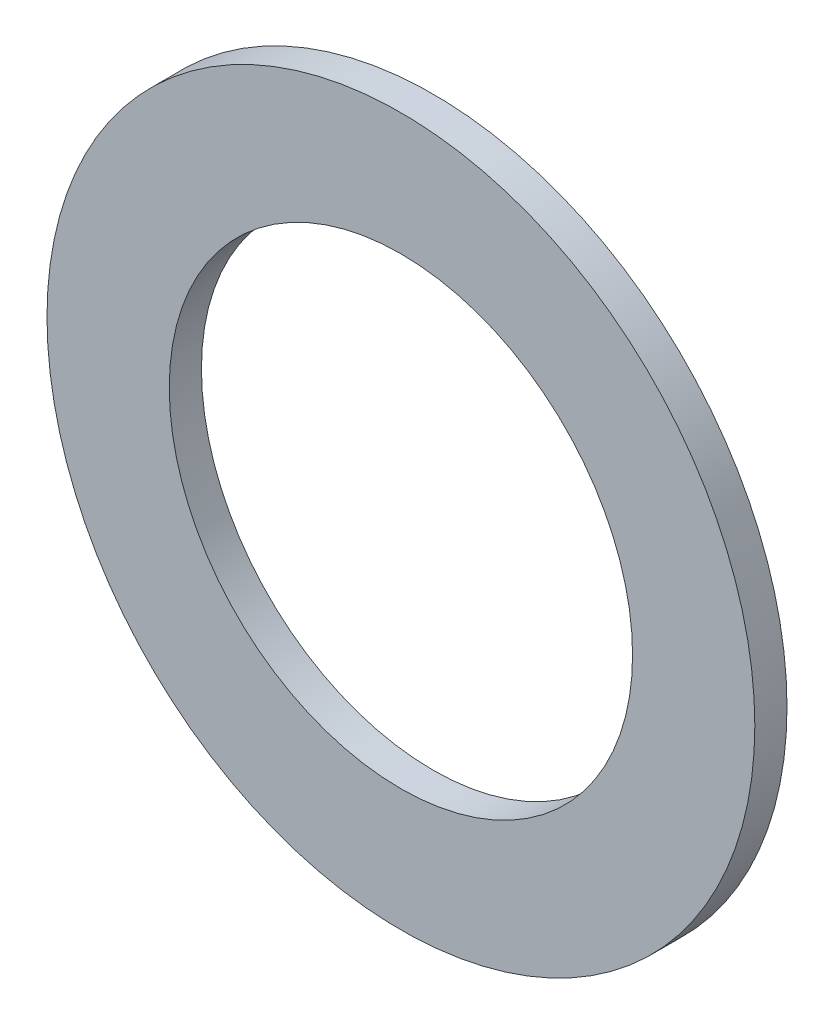
ISO-10303-21;
HEADER;
FILE_DESCRIPTION(('STEP AP214'),'2;1');
FILE_NAME('part.step','',(''),(''),'','','');
FILE_SCHEMA(('AUTOMOTIVE_DESIGN { 1 0 10303 214 1 1 1 1 }'));
ENDSEC;
DATA;
#1=APPLICATION_CONTEXT('core data for automotive mechanical design processes');
#2=APPLICATION_PROTOCOL_DEFINITION('international standard','automotive_design',2000,#1);
#3=PRODUCT_CONTEXT('',#1,'mechanical');
#4=PRODUCT('Part','Part','',(#3));
#5=PRODUCT_RELATED_PRODUCT_CATEGORY('part','',(#4));
#6=PRODUCT_DEFINITION_FORMATION('','',#4);
#7=PRODUCT_DEFINITION_CONTEXT('part definition',#1,'design');
#8=PRODUCT_DEFINITION('design','',#6,#7);
#9=PRODUCT_DEFINITION_SHAPE('','',#8);
#10=(LENGTH_UNIT() NAMED_UNIT(*) SI_UNIT(.MILLI.,.METRE.));
#11=(NAMED_UNIT(*) PLANE_ANGLE_UNIT() SI_UNIT($,.RADIAN.));
#12=(NAMED_UNIT(*) SI_UNIT($,.STERADIAN.) SOLID_ANGLE_UNIT());
#13=UNCERTAINTY_MEASURE_WITH_UNIT(LENGTH_MEASURE(1.E-05),#10,'distance_accuracy_value','');
#14=(GEOMETRIC_REPRESENTATION_CONTEXT(3) GLOBAL_UNCERTAINTY_ASSIGNED_CONTEXT((#13)) GLOBAL_UNIT_ASSIGNED_CONTEXT((#10,
#11,#12)) REPRESENTATION_CONTEXT('',''));
#15=CARTESIAN_POINT('',(0.,0.,0.));
#16=DIRECTION('',(0.,0.,1.));
#17=DIRECTION('',(1.,0.,0.));
#18=AXIS2_PLACEMENT_3D('',#15,#16,#17);
#19=CARTESIAN_POINT('',(0.,0.,-0.5));
#20=DIRECTION('',(0.,0.,-1.));
#21=DIRECTION('',(1.,0.,0.));
#22=AXIS2_PLACEMENT_3D('',#19,#20,#21);
#23=PLANE('',#22);
#24=CARTESIAN_POINT('',(0.,0.,-0.5));
#25=DIRECTION('',(0.,0.,1.));
#26=DIRECTION('',(1.,0.,0.));
#27=AXIS2_PLACEMENT_3D('',#24,#25,#26);
#28=CIRCLE('',#27,5.5);
#29=CARTESIAN_POINT('',(5.5,0.,-0.5));
#30=VERTEX_POINT('',#29);
#31=EDGE_CURVE('E10',#30,#30,#28,.T.);
#32=ORIENTED_EDGE('',*,*,#31,.F.);
#33=EDGE_LOOP('',(#32));
#34=FACE_BOUND('',#33,.T.);
#35=CARTESIAN_POINT('',(0.,0.,-0.5));
#36=DIRECTION('',(0.,0.,1.));
#37=DIRECTION('',(1.,0.,0.));
#38=AXIS2_PLACEMENT_3D('',#35,#36,#37);
#39=CIRCLE('',#38,3.6);
#40=CARTESIAN_POINT('',(3.6,0.,-0.5));
#41=VERTEX_POINT('',#40);
#42=EDGE_CURVE('E48',#41,#41,#39,.T.);
#43=ORIENTED_EDGE('',*,*,#42,.T.);
#44=EDGE_LOOP('',(#43));
#45=FACE_BOUND('',#44,.T.);
#46=ADVANCED_FACE('F37',(#34,#45),#23,.T.);
#47=CARTESIAN_POINT('',(0.,0.,0.));
#48=DIRECTION('',(0.,0.,-1.));
#49=DIRECTION('',(1.,0.,0.));
#50=AXIS2_PLACEMENT_3D('',#47,#48,#49);
#51=PLANE('',#50);
#52=CARTESIAN_POINT('',(0.,0.,0.));
#53=DIRECTION('',(0.,0.,1.));
#54=DIRECTION('',(1.,0.,0.));
#55=AXIS2_PLACEMENT_3D('',#52,#53,#54);
#56=CIRCLE('',#55,5.5);
#57=CARTESIAN_POINT('',(5.5,0.,0.));
#58=VERTEX_POINT('',#57);
#59=EDGE_CURVE('E41',#58,#58,#56,.T.);
#60=ORIENTED_EDGE('',*,*,#59,.T.);
#61=EDGE_LOOP('',(#60));
#62=FACE_BOUND('',#61,.T.);
#63=CARTESIAN_POINT('',(0.,0.,0.));
#64=DIRECTION('',(0.,0.,1.));
#65=DIRECTION('',(1.,0.,0.));
#66=AXIS2_PLACEMENT_3D('',#63,#64,#65);
#67=CIRCLE('',#66,3.6);
#68=CARTESIAN_POINT('',(3.6,0.,0.));
#69=VERTEX_POINT('',#68);
#70=EDGE_CURVE('E50',#69,#69,#67,.T.);
#71=ORIENTED_EDGE('',*,*,#70,.F.);
#72=EDGE_LOOP('',(#71));
#73=FACE_BOUND('',#72,.T.);
#74=ADVANCED_FACE('F63',(#62,#73),#51,.F.);
#75=CARTESIAN_POINT('',(0.,0.,-0.5));
#76=DIRECTION('',(0.,0.,1.));
#77=DIRECTION('',(-1.,0.,0.));
#78=AXIS2_PLACEMENT_3D('',#75,#76,#77);
#79=CYLINDRICAL_SURFACE('',#78,5.5);
#80=ORIENTED_EDGE('',*,*,#31,.T.);
#81=EDGE_LOOP('',(#80));
#82=FACE_BOUND('',#81,.T.);
#83=ORIENTED_EDGE('',*,*,#59,.F.);
#84=EDGE_LOOP('',(#83));
#85=FACE_BOUND('',#84,.T.);
#86=ADVANCED_FACE('F39',(#82,#85),#79,.T.);
#87=CARTESIAN_POINT('',(0.,0.,-0.5));
#88=DIRECTION('',(0.,0.,1.));
#89=DIRECTION('',(-1.,0.,0.));
#90=AXIS2_PLACEMENT_3D('',#87,#88,#89);
#91=CYLINDRICAL_SURFACE('',#90,3.6);
#92=ORIENTED_EDGE('',*,*,#42,.F.);
#93=EDGE_LOOP('',(#92));
#94=FACE_BOUND('',#93,.T.);
#95=ORIENTED_EDGE('',*,*,#70,.T.);
#96=EDGE_LOOP('',(#95));
#97=FACE_BOUND('',#96,.T.);
#98=ADVANCED_FACE('F57',(#94,#97),#91,.F.);
#99=CLOSED_SHELL('',(#46,#74,#86,#98));
#100=MANIFOLD_SOLID_BREP('B2',#99);
#101=ADVANCED_BREP_SHAPE_REPRESENTATION('',(#18,#100),#14);
#102=SHAPE_DEFINITION_REPRESENTATION(#9,#101);
ENDSEC;
END-ISO-10303-21;
